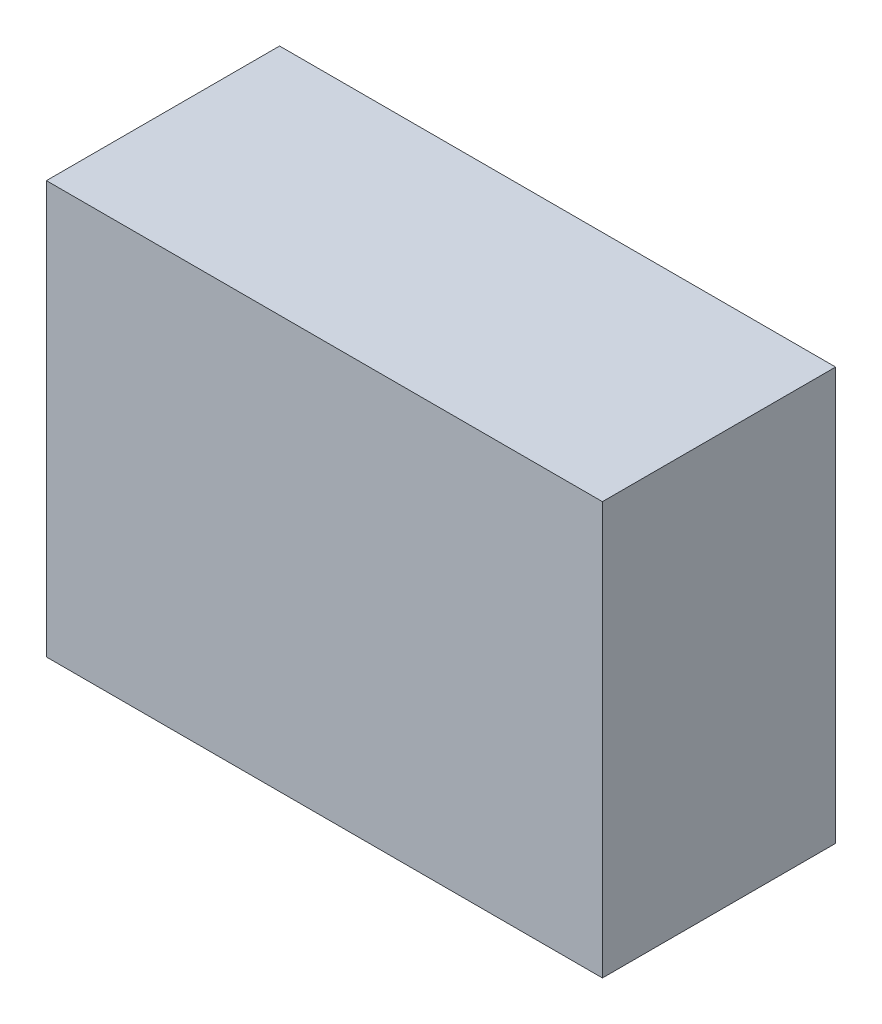
ISO-10303-21;
HEADER;
FILE_DESCRIPTION(('STEP AP214'),'2;1');
FILE_NAME('part.step','',(''),(''),'','','');
FILE_SCHEMA(('AUTOMOTIVE_DESIGN { 1 0 10303 214 1 1 1 1 }'));
ENDSEC;
DATA;
#1=APPLICATION_CONTEXT('core data for automotive mechanical design processes');
#2=APPLICATION_PROTOCOL_DEFINITION('international standard','automotive_design',2000,#1);
#3=PRODUCT_CONTEXT('',#1,'mechanical');
#4=PRODUCT('Part','Part','',(#3));
#5=PRODUCT_RELATED_PRODUCT_CATEGORY('part','',(#4));
#6=PRODUCT_DEFINITION_FORMATION('','',#4);
#7=PRODUCT_DEFINITION_CONTEXT('part definition',#1,'design');
#8=PRODUCT_DEFINITION('design','',#6,#7);
#9=PRODUCT_DEFINITION_SHAPE('','',#8);
#10=(LENGTH_UNIT() NAMED_UNIT(*) SI_UNIT(.MILLI.,.METRE.));
#11=(NAMED_UNIT(*) PLANE_ANGLE_UNIT() SI_UNIT($,.RADIAN.));
#12=(NAMED_UNIT(*) SI_UNIT($,.STERADIAN.) SOLID_ANGLE_UNIT());
#13=UNCERTAINTY_MEASURE_WITH_UNIT(LENGTH_MEASURE(1.E-05),#10,'distance_accuracy_value','');
#14=(GEOMETRIC_REPRESENTATION_CONTEXT(3) GLOBAL_UNCERTAINTY_ASSIGNED_CONTEXT((#13)) GLOBAL_UNIT_ASSIGNED_CONTEXT((#10,
#11,#12)) REPRESENTATION_CONTEXT('',''));
#15=CARTESIAN_POINT('',(0.,0.,0.));
#16=DIRECTION('',(0.,0.,1.));
#17=DIRECTION('',(1.,0.,0.));
#18=AXIS2_PLACEMENT_3D('',#15,#16,#17);
#19=CARTESIAN_POINT('',(77.5,57.5,65.));
#20=DIRECTION('',(-1.,0.,0.));
#21=DIRECTION('',(0.,0.,1.));
#22=AXIS2_PLACEMENT_3D('',#19,#20,#21);
#23=PLANE('',#22);
#24=DIRECTION('',(0.,1.,0.));
#25=VECTOR('',#24,1.);
#26=CARTESIAN_POINT('',(77.5,57.5,0.));
#27=LINE('',#26,#25);
#28=CARTESIAN_POINT('',(77.5,-57.5,0.));
#29=VERTEX_POINT('',#28);
#30=CARTESIAN_POINT('',(77.5,57.5,0.));
#31=VERTEX_POINT('',#30);
#32=EDGE_CURVE('E158',#29,#31,#27,.T.);
#33=ORIENTED_EDGE('',*,*,#32,.T.);
#34=DIRECTION('',(0.,0.,-1.));
#35=VECTOR('',#34,1.);
#36=CARTESIAN_POINT('',(77.5,57.5,65.));
#37=LINE('',#36,#35);
#38=CARTESIAN_POINT('',(77.5,57.5,65.));
#39=VERTEX_POINT('',#38);
#40=EDGE_CURVE('E11',#39,#31,#37,.T.);
#41=ORIENTED_EDGE('',*,*,#40,.F.);
#42=DIRECTION('',(0.,1.,0.));
#43=VECTOR('',#42,1.);
#44=CARTESIAN_POINT('',(77.5,57.5,65.));
#45=LINE('',#44,#43);
#46=CARTESIAN_POINT('',(77.5,-57.5,65.));
#47=VERTEX_POINT('',#46);
#48=EDGE_CURVE('E164',#47,#39,#45,.T.);
#49=ORIENTED_EDGE('',*,*,#48,.F.);
#50=DIRECTION('',(0.,0.,-1.));
#51=VECTOR('',#50,1.);
#52=CARTESIAN_POINT('',(77.5,-57.5,65.));
#53=LINE('',#52,#51);
#54=EDGE_CURVE('E174',#47,#29,#53,.T.);
#55=ORIENTED_EDGE('',*,*,#54,.T.);
#56=EDGE_LOOP('',(#33,#41,#49,#55));
#57=FACE_BOUND('',#56,.T.);
#58=ADVANCED_FACE('F39',(#57),#23,.F.);
#59=CARTESIAN_POINT('',(-77.5,57.5,65.));
#60=DIRECTION('',(0.,-1.,0.));
#61=DIRECTION('',(0.,0.,-1.));
#62=AXIS2_PLACEMENT_3D('',#59,#60,#61);
#63=PLANE('',#62);
#64=DIRECTION('',(-1.,0.,0.));
#65=VECTOR('',#64,1.);
#66=CARTESIAN_POINT('',(-77.5,57.5,0.));
#67=LINE('',#66,#65);
#68=CARTESIAN_POINT('',(-77.5,57.5,0.));
#69=VERTEX_POINT('',#68);
#70=EDGE_CURVE('E178',#31,#69,#67,.T.);
#71=ORIENTED_EDGE('',*,*,#70,.T.);
#72=DIRECTION('',(0.,0.,-1.));
#73=VECTOR('',#72,1.);
#74=CARTESIAN_POINT('',(-77.5,57.5,65.));
#75=LINE('',#74,#73);
#76=CARTESIAN_POINT('',(-77.5,57.5,65.));
#77=VERTEX_POINT('',#76);
#78=EDGE_CURVE('E47',#77,#69,#75,.T.);
#79=ORIENTED_EDGE('',*,*,#78,.F.);
#80=DIRECTION('',(-1.,0.,0.));
#81=VECTOR('',#80,1.);
#82=CARTESIAN_POINT('',(-77.5,57.5,65.));
#83=LINE('',#82,#81);
#84=EDGE_CURVE('E91',#39,#77,#83,.T.);
#85=ORIENTED_EDGE('',*,*,#84,.F.);
#86=ORIENTED_EDGE('',*,*,#40,.T.);
#87=EDGE_LOOP('',(#71,#79,#85,#86));
#88=FACE_BOUND('',#87,.T.);
#89=ADVANCED_FACE('F212',(#88),#63,.F.);
#90=CARTESIAN_POINT('',(-77.5,57.5,65.));
#91=DIRECTION('',(1.,0.,0.));
#92=DIRECTION('',(0.,0.,-1.));
#93=AXIS2_PLACEMENT_3D('',#90,#91,#92);
#94=PLANE('',#93);
#95=DIRECTION('',(0.,-1.,0.));
#96=VECTOR('',#95,1.);
#97=CARTESIAN_POINT('',(-77.5,57.5,0.));
#98=LINE('',#97,#96);
#99=CARTESIAN_POINT('',(-77.5,-57.5,0.));
#100=VERTEX_POINT('',#99);
#101=EDGE_CURVE('E181',#69,#100,#98,.T.);
#102=ORIENTED_EDGE('',*,*,#101,.T.);
#103=DIRECTION('',(0.,0.,-1.));
#104=VECTOR('',#103,1.);
#105=CARTESIAN_POINT('',(-77.5,-57.5,65.));
#106=LINE('',#105,#104);
#107=CARTESIAN_POINT('',(-77.5,-57.5,65.));
#108=VERTEX_POINT('',#107);
#109=EDGE_CURVE('E188',#108,#100,#106,.T.);
#110=ORIENTED_EDGE('',*,*,#109,.F.);
#111=DIRECTION('',(0.,-1.,0.));
#112=VECTOR('',#111,1.);
#113=CARTESIAN_POINT('',(-77.5,57.5,65.));
#114=LINE('',#113,#112);
#115=EDGE_CURVE('E169',#77,#108,#114,.T.);
#116=ORIENTED_EDGE('',*,*,#115,.F.);
#117=ORIENTED_EDGE('',*,*,#78,.T.);
#118=EDGE_LOOP('',(#102,#110,#116,#117));
#119=FACE_BOUND('',#118,.T.);
#120=ADVANCED_FACE('F195',(#119),#94,.F.);
#121=CARTESIAN_POINT('',(-77.5,-57.5,65.));
#122=DIRECTION('',(0.,1.,0.));
#123=DIRECTION('',(0.,0.,1.));
#124=AXIS2_PLACEMENT_3D('',#121,#122,#123);
#125=PLANE('',#124);
#126=DIRECTION('',(1.,0.,0.));
#127=VECTOR('',#126,1.);
#128=CARTESIAN_POINT('',(-77.5,-57.5,0.));
#129=LINE('',#128,#127);
#130=EDGE_CURVE('E84',#100,#29,#129,.T.);
#131=ORIENTED_EDGE('',*,*,#130,.T.);
#132=ORIENTED_EDGE('',*,*,#54,.F.);
#133=DIRECTION('',(1.,0.,0.));
#134=VECTOR('',#133,1.);
#135=CARTESIAN_POINT('',(-77.5,-57.5,65.));
#136=LINE('',#135,#134);
#137=EDGE_CURVE('E63',#108,#47,#136,.T.);
#138=ORIENTED_EDGE('',*,*,#137,.F.);
#139=ORIENTED_EDGE('',*,*,#109,.T.);
#140=EDGE_LOOP('',(#131,#132,#138,#139));
#141=FACE_BOUND('',#140,.T.);
#142=ADVANCED_FACE('F203',(#141),#125,.F.);
#143=CARTESIAN_POINT('',(0.,0.,65.));
#144=DIRECTION('',(0.,0.,1.));
#145=DIRECTION('',(1.,0.,0.));
#146=AXIS2_PLACEMENT_3D('',#143,#144,#145);
#147=PLANE('',#146);
#148=ORIENTED_EDGE('',*,*,#48,.T.);
#149=ORIENTED_EDGE('',*,*,#84,.T.);
#150=ORIENTED_EDGE('',*,*,#115,.T.);
#151=ORIENTED_EDGE('',*,*,#137,.T.);
#152=EDGE_LOOP('',(#148,#149,#150,#151));
#153=FACE_BOUND('',#152,.T.);
#154=ADVANCED_FACE('F205',(#153),#147,.T.);
#155=CARTESIAN_POINT('',(0.,0.,0.));
#156=DIRECTION('',(0.,0.,1.));
#157=DIRECTION('',(1.,0.,0.));
#158=AXIS2_PLACEMENT_3D('',#155,#156,#157);
#159=PLANE('',#158);
#160=DIRECTION('',(1.,0.,0.));
#161=VECTOR('',#160,1.);
#162=CARTESIAN_POINT('',(74.5,54.5,0.));
#163=LINE('',#162,#161);
#164=CARTESIAN_POINT('',(-74.5,54.5,0.));
#165=VERTEX_POINT('',#164);
#166=CARTESIAN_POINT('',(74.5,54.5,0.));
#167=VERTEX_POINT('',#166);
#168=EDGE_CURVE('E149',#165,#167,#163,.T.);
#169=ORIENTED_EDGE('',*,*,#168,.F.);
#170=DIRECTION('',(0.,1.,0.));
#171=VECTOR('',#170,1.);
#172=CARTESIAN_POINT('',(-74.5,54.5,0.));
#173=LINE('',#172,#171);
#174=CARTESIAN_POINT('',(-74.5,-54.5,0.));
#175=VERTEX_POINT('',#174);
#176=EDGE_CURVE('E54',#175,#165,#173,.T.);
#177=ORIENTED_EDGE('',*,*,#176,.F.);
#178=DIRECTION('',(-1.,0.,0.));
#179=VECTOR('',#178,1.);
#180=CARTESIAN_POINT('',(74.5,-54.5,0.));
#181=LINE('',#180,#179);
#182=CARTESIAN_POINT('',(74.5,-54.5,0.));
#183=VERTEX_POINT('',#182);
#184=EDGE_CURVE('E136',#183,#175,#181,.T.);
#185=ORIENTED_EDGE('',*,*,#184,.F.);
#186=DIRECTION('',(0.,-1.,0.));
#187=VECTOR('',#186,1.);
#188=CARTESIAN_POINT('',(74.5,54.5,0.));
#189=LINE('',#188,#187);
#190=EDGE_CURVE('E140',#167,#183,#189,.T.);
#191=ORIENTED_EDGE('',*,*,#190,.F.);
#192=EDGE_LOOP('',(#169,#177,#185,#191));
#193=FACE_BOUND('',#192,.T.);
#194=ORIENTED_EDGE('',*,*,#32,.F.);
#195=ORIENTED_EDGE('',*,*,#130,.F.);
#196=ORIENTED_EDGE('',*,*,#101,.F.);
#197=ORIENTED_EDGE('',*,*,#70,.F.);
#198=EDGE_LOOP('',(#194,#195,#196,#197));
#199=FACE_BOUND('',#198,.T.);
#200=ADVANCED_FACE('F199',(#193,#199),#159,.F.);
#201=CARTESIAN_POINT('',(-74.5,54.5,62.));
#202=DIRECTION('',(-1.,0.,0.));
#203=DIRECTION('',(0.,0.,1.));
#204=AXIS2_PLACEMENT_3D('',#201,#202,#203);
#205=PLANE('',#204);
#206=ORIENTED_EDGE('',*,*,#176,.T.);
#207=DIRECTION('',(0.,0.,-1.));
#208=VECTOR('',#207,1.);
#209=CARTESIAN_POINT('',(-74.5,54.5,62.));
#210=LINE('',#209,#208);
#211=CARTESIAN_POINT('',(-74.5,54.5,62.));
#212=VERTEX_POINT('',#211);
#213=EDGE_CURVE('E111',#212,#165,#210,.T.);
#214=ORIENTED_EDGE('',*,*,#213,.F.);
#215=DIRECTION('',(0.,1.,0.));
#216=VECTOR('',#215,1.);
#217=CARTESIAN_POINT('',(-74.5,54.5,62.));
#218=LINE('',#217,#216);
#219=CARTESIAN_POINT('',(-74.5,-54.5,62.));
#220=VERTEX_POINT('',#219);
#221=EDGE_CURVE('E115',#220,#212,#218,.T.);
#222=ORIENTED_EDGE('',*,*,#221,.F.);
#223=DIRECTION('',(0.,0.,-1.));
#224=VECTOR('',#223,1.);
#225=CARTESIAN_POINT('',(-74.5,-54.5,62.));
#226=LINE('',#225,#224);
#227=EDGE_CURVE('E155',#220,#175,#226,.T.);
#228=ORIENTED_EDGE('',*,*,#227,.T.);
#229=EDGE_LOOP('',(#206,#214,#222,#228));
#230=FACE_BOUND('',#229,.T.);
#231=ADVANCED_FACE('F113',(#230),#205,.F.);
#232=CARTESIAN_POINT('',(74.5,-54.5,62.));
#233=DIRECTION('',(0.,-1.,0.));
#234=DIRECTION('',(0.,0.,-1.));
#235=AXIS2_PLACEMENT_3D('',#232,#233,#234);
#236=PLANE('',#235);
#237=ORIENTED_EDGE('',*,*,#184,.T.);
#238=ORIENTED_EDGE('',*,*,#227,.F.);
#239=DIRECTION('',(-1.,0.,0.));
#240=VECTOR('',#239,1.);
#241=CARTESIAN_POINT('',(74.5,-54.5,62.));
#242=LINE('',#241,#240);
#243=CARTESIAN_POINT('',(74.5,-54.5,62.));
#244=VERTEX_POINT('',#243);
#245=EDGE_CURVE('E122',#244,#220,#242,.T.);
#246=ORIENTED_EDGE('',*,*,#245,.F.);
#247=DIRECTION('',(0.,0.,-1.));
#248=VECTOR('',#247,1.);
#249=CARTESIAN_POINT('',(74.5,-54.5,62.));
#250=LINE('',#249,#248);
#251=EDGE_CURVE('E159',#244,#183,#250,.T.);
#252=ORIENTED_EDGE('',*,*,#251,.T.);
#253=EDGE_LOOP('',(#237,#238,#246,#252));
#254=FACE_BOUND('',#253,.T.);
#255=ADVANCED_FACE('F252',(#254),#236,.F.);
#256=CARTESIAN_POINT('',(74.5,54.5,62.));
#257=DIRECTION('',(1.,0.,0.));
#258=DIRECTION('',(0.,0.,-1.));
#259=AXIS2_PLACEMENT_3D('',#256,#257,#258);
#260=PLANE('',#259);
#261=ORIENTED_EDGE('',*,*,#190,.T.);
#262=ORIENTED_EDGE('',*,*,#251,.F.);
#263=DIRECTION('',(0.,-1.,0.));
#264=VECTOR('',#263,1.);
#265=CARTESIAN_POINT('',(74.5,54.5,62.));
#266=LINE('',#265,#264);
#267=CARTESIAN_POINT('',(74.5,54.5,62.));
#268=VERTEX_POINT('',#267);
#269=EDGE_CURVE('E131',#268,#244,#266,.T.);
#270=ORIENTED_EDGE('',*,*,#269,.F.);
#271=DIRECTION('',(0.,0.,-1.));
#272=VECTOR('',#271,1.);
#273=CARTESIAN_POINT('',(74.5,54.5,62.));
#274=LINE('',#273,#272);
#275=EDGE_CURVE('E121',#268,#167,#274,.T.);
#276=ORIENTED_EDGE('',*,*,#275,.T.);
#277=EDGE_LOOP('',(#261,#262,#270,#276));
#278=FACE_BOUND('',#277,.T.);
#279=ADVANCED_FACE('F261',(#278),#260,.F.);
#280=CARTESIAN_POINT('',(74.5,54.5,62.));
#281=DIRECTION('',(0.,1.,0.));
#282=DIRECTION('',(0.,0.,1.));
#283=AXIS2_PLACEMENT_3D('',#280,#281,#282);
#284=PLANE('',#283);
#285=ORIENTED_EDGE('',*,*,#168,.T.);
#286=ORIENTED_EDGE('',*,*,#275,.F.);
#287=DIRECTION('',(1.,0.,0.));
#288=VECTOR('',#287,1.);
#289=CARTESIAN_POINT('',(74.5,54.5,62.));
#290=LINE('',#289,#288);
#291=EDGE_CURVE('E125',#212,#268,#290,.T.);
#292=ORIENTED_EDGE('',*,*,#291,.F.);
#293=ORIENTED_EDGE('',*,*,#213,.T.);
#294=EDGE_LOOP('',(#285,#286,#292,#293));
#295=FACE_BOUND('',#294,.T.);
#296=ADVANCED_FACE('F126',(#295),#284,.F.);
#297=CARTESIAN_POINT('',(0.,0.,62.));
#298=DIRECTION('',(0.,0.,-1.));
#299=DIRECTION('',(-1.,0.,0.));
#300=AXIS2_PLACEMENT_3D('',#297,#298,#299);
#301=PLANE('',#300);
#302=ORIENTED_EDGE('',*,*,#221,.T.);
#303=ORIENTED_EDGE('',*,*,#291,.T.);
#304=ORIENTED_EDGE('',*,*,#269,.T.);
#305=ORIENTED_EDGE('',*,*,#245,.T.);
#306=EDGE_LOOP('',(#302,#303,#304,#305));
#307=FACE_BOUND('',#306,.T.);
#308=ADVANCED_FACE('F133',(#307),#301,.T.);
#309=CLOSED_SHELL('',(#58,#89,#120,#142,#154,#200,#231,#255,#279,#296,#308));
#310=MANIFOLD_SOLID_BREP('B2',#309);
#311=ADVANCED_BREP_SHAPE_REPRESENTATION('',(#18,#310),#14);
#312=SHAPE_DEFINITION_REPRESENTATION(#9,#311);
ENDSEC;
END-ISO-10303-21;
